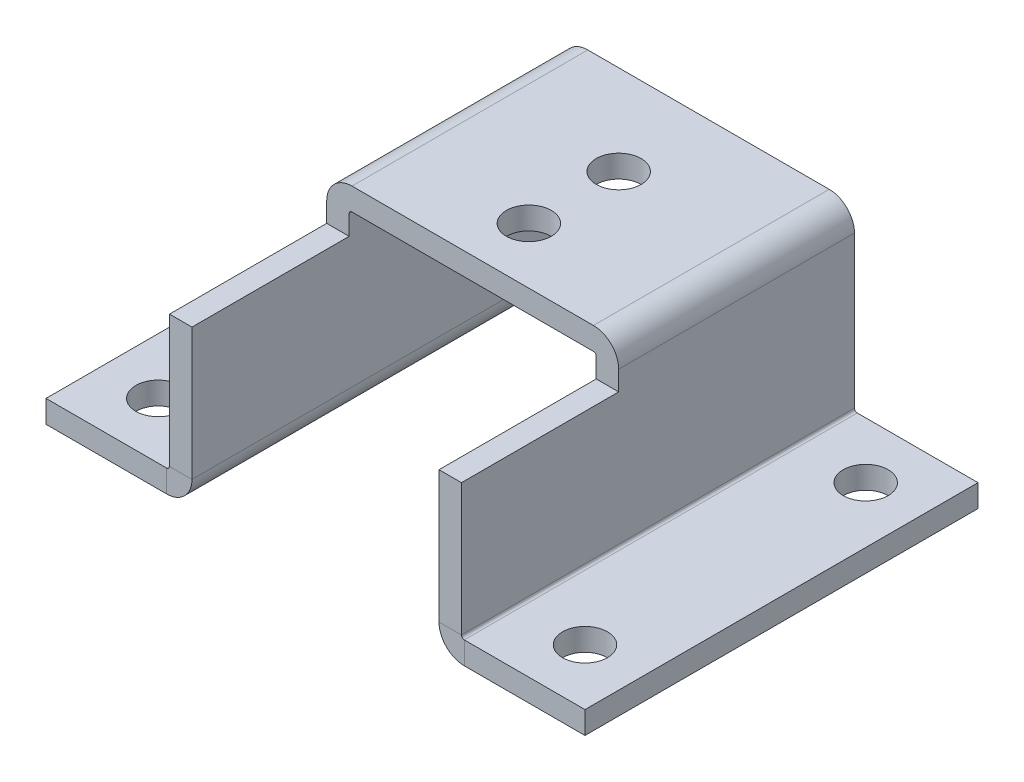
ISO-10303-21;
HEADER;
FILE_DESCRIPTION(('STEP AP214'),'2;1');
FILE_NAME('part.step','',(''),(''),'','','');
FILE_SCHEMA(('AUTOMOTIVE_DESIGN { 1 0 10303 214 1 1 1 1 }'));
ENDSEC;
DATA;
#1=APPLICATION_CONTEXT('core data for automotive mechanical design processes');
#2=APPLICATION_PROTOCOL_DEFINITION('international standard','automotive_design',2000,#1);
#3=PRODUCT_CONTEXT('',#1,'mechanical');
#4=PRODUCT('Part','Part','',(#3));
#5=PRODUCT_RELATED_PRODUCT_CATEGORY('part','',(#4));
#6=PRODUCT_DEFINITION_FORMATION('','',#4);
#7=PRODUCT_DEFINITION_CONTEXT('part definition',#1,'design');
#8=PRODUCT_DEFINITION('design','',#6,#7);
#9=PRODUCT_DEFINITION_SHAPE('','',#8);
#10=(LENGTH_UNIT() NAMED_UNIT(*) SI_UNIT(.MILLI.,.METRE.));
#11=(NAMED_UNIT(*) PLANE_ANGLE_UNIT() SI_UNIT($,.RADIAN.));
#12=(NAMED_UNIT(*) SI_UNIT($,.STERADIAN.) SOLID_ANGLE_UNIT());
#13=UNCERTAINTY_MEASURE_WITH_UNIT(LENGTH_MEASURE(1.E-05),#10,'distance_accuracy_value','');
#14=(GEOMETRIC_REPRESENTATION_CONTEXT(3) GLOBAL_UNCERTAINTY_ASSIGNED_CONTEXT((#13)) GLOBAL_UNIT_ASSIGNED_CONTEXT((#10,
#11,#12)) REPRESENTATION_CONTEXT('',''));
#15=CARTESIAN_POINT('',(0.,0.,0.));
#16=DIRECTION('',(0.,0.,1.));
#17=DIRECTION('',(1.,0.,0.));
#18=AXIS2_PLACEMENT_3D('',#15,#16,#17);
#19=CARTESIAN_POINT('',(-24.,-16.,0.));
#20=DIRECTION('',(-1.,0.,0.));
#21=DIRECTION('',(0.,0.,1.));
#22=AXIS2_PLACEMENT_3D('',#19,#20,#21);
#23=PLANE('',#22);
#24=DIRECTION('',(0.,1.,0.));
#25=VECTOR('',#24,1.);
#26=CARTESIAN_POINT('',(-24.,-15.,-17.5));
#27=LINE('',#26,#25);
#28=CARTESIAN_POINT('',(-24.,-17.,-17.5));
#29=VERTEX_POINT('',#28);
#30=CARTESIAN_POINT('',(-24.,-15.,-17.5));
#31=VERTEX_POINT('',#30);
#32=EDGE_CURVE('E265',#29,#31,#27,.T.);
#33=ORIENTED_EDGE('',*,*,#32,.F.);
#34=DIRECTION('',(0.,0.,-1.));
#35=VECTOR('',#34,1.);
#36=CARTESIAN_POINT('',(-24.,-17.,-17.5));
#37=LINE('',#36,#35);
#38=CARTESIAN_POINT('',(-24.,-17.,17.5));
#39=VERTEX_POINT('',#38);
#40=EDGE_CURVE('E262',#39,#29,#37,.T.);
#41=ORIENTED_EDGE('',*,*,#40,.F.);
#42=DIRECTION('',(0.,-1.,0.));
#43=VECTOR('',#42,1.);
#44=CARTESIAN_POINT('',(-24.,-17.,17.5));
#45=LINE('',#44,#43);
#46=CARTESIAN_POINT('',(-24.,-15.,17.5));
#47=VERTEX_POINT('',#46);
#48=EDGE_CURVE('E266',#47,#39,#45,.T.);
#49=ORIENTED_EDGE('',*,*,#48,.F.);
#50=DIRECTION('',(0.,0.,1.));
#51=VECTOR('',#50,1.);
#52=CARTESIAN_POINT('',(-24.,-15.,17.5));
#53=LINE('',#52,#51);
#54=EDGE_CURVE('E328',#31,#47,#53,.T.);
#55=ORIENTED_EDGE('',*,*,#54,.F.);
#56=EDGE_LOOP('',(#33,#41,#49,#55));
#57=FACE_BOUND('',#56,.T.);
#58=ADVANCED_FACE('F38',(#57),#23,.T.);
#59=CARTESIAN_POINT('',(24.,-16.,0.));
#60=DIRECTION('',(-1.,0.,0.));
#61=DIRECTION('',(0.,0.,1.));
#62=AXIS2_PLACEMENT_3D('',#59,#60,#61);
#63=PLANE('',#62);
#64=DIRECTION('',(0.,1.,0.));
#65=VECTOR('',#64,1.);
#66=CARTESIAN_POINT('',(24.,-15.,-17.5));
#67=LINE('',#66,#65);
#68=CARTESIAN_POINT('',(24.,-17.,-17.5));
#69=VERTEX_POINT('',#68);
#70=CARTESIAN_POINT('',(24.,-15.,-17.5));
#71=VERTEX_POINT('',#70);
#72=EDGE_CURVE('E62',#69,#71,#67,.T.);
#73=ORIENTED_EDGE('',*,*,#72,.T.);
#74=DIRECTION('',(0.,0.,1.));
#75=VECTOR('',#74,1.);
#76=CARTESIAN_POINT('',(24.,-15.,17.5));
#77=LINE('',#76,#75);
#78=CARTESIAN_POINT('',(24.,-15.,17.5));
#79=VERTEX_POINT('',#78);
#80=EDGE_CURVE('E371',#71,#79,#77,.T.);
#81=ORIENTED_EDGE('',*,*,#80,.T.);
#82=DIRECTION('',(0.,-1.,0.));
#83=VECTOR('',#82,1.);
#84=CARTESIAN_POINT('',(24.,-17.,17.5));
#85=LINE('',#84,#83);
#86=CARTESIAN_POINT('',(24.,-17.,17.5));
#87=VERTEX_POINT('',#86);
#88=EDGE_CURVE('E252',#79,#87,#85,.T.);
#89=ORIENTED_EDGE('',*,*,#88,.T.);
#90=DIRECTION('',(0.,0.,-1.));
#91=VECTOR('',#90,1.);
#92=CARTESIAN_POINT('',(24.,-17.,-17.5));
#93=LINE('',#92,#91);
#94=EDGE_CURVE('E258',#87,#69,#93,.T.);
#95=ORIENTED_EDGE('',*,*,#94,.T.);
#96=EDGE_LOOP('',(#73,#81,#89,#95));
#97=FACE_BOUND('',#96,.T.);
#98=ADVANCED_FACE('F558',(#97),#63,.F.);
#99=CARTESIAN_POINT('',(-24.,-17.,17.5));
#100=DIRECTION('',(0.,0.,1.));
#101=DIRECTION('',(1.,0.,0.));
#102=AXIS2_PLACEMENT_3D('',#99,#100,#101);
#103=PLANE('',#102);
#104=DIRECTION('',(1.,0.,0.));
#105=VECTOR('',#104,1.);
#106=CARTESIAN_POINT('',(-24.,-17.,17.5));
#107=LINE('',#106,#105);
#108=CARTESIAN_POINT('',(-13.25,-17.,17.5));
#109=VERTEX_POINT('',#108);
#110=EDGE_CURVE('E271',#39,#109,#107,.T.);
#111=ORIENTED_EDGE('',*,*,#110,.T.);
#112=DIRECTION('',(0.,-1.,0.));
#113=VECTOR('',#112,1.);
#114=CARTESIAN_POINT('',(-13.25,-17.,17.5));
#115=LINE('',#114,#113);
#116=CARTESIAN_POINT('',(-13.25,-15.,17.5));
#117=VERTEX_POINT('',#116);
#118=EDGE_CURVE('E443',#117,#109,#115,.T.);
#119=ORIENTED_EDGE('',*,*,#118,.F.);
#120=DIRECTION('',(1.,0.,0.));
#121=VECTOR('',#120,1.);
#122=CARTESIAN_POINT('',(-24.,-15.,17.5));
#123=LINE('',#122,#121);
#124=EDGE_CURVE('E374',#47,#117,#123,.T.);
#125=ORIENTED_EDGE('',*,*,#124,.F.);
#126=ORIENTED_EDGE('',*,*,#48,.T.);
#127=EDGE_LOOP('',(#111,#119,#125,#126));
#128=FACE_BOUND('',#127,.T.);
#129=ADVANCED_FACE('F469',(#128),#103,.T.);
#130=CARTESIAN_POINT('',(-24.,-17.,-17.5));
#131=DIRECTION('',(0.,-1.,0.));
#132=DIRECTION('',(1.,0.,0.));
#133=AXIS2_PLACEMENT_3D('',#130,#131,#132);
#134=PLANE('',#133);
#135=CARTESIAN_POINT('',(-19.,-17.,-12.5));
#136=DIRECTION('',(0.,1.,0.));
#137=DIRECTION('',(-1.,0.,0.));
#138=AXIS2_PLACEMENT_3D('',#135,#136,#137);
#139=CIRCLE('',#138,2.);
#140=CARTESIAN_POINT('',(-21.,-17.,-12.5));
#141=VERTEX_POINT('',#140);
#142=EDGE_CURVE('E396',#141,#141,#139,.T.);
#143=ORIENTED_EDGE('',*,*,#142,.T.);
#144=EDGE_LOOP('',(#143));
#145=FACE_BOUND('',#144,.T.);
#146=CARTESIAN_POINT('',(-19.,-17.,12.5));
#147=DIRECTION('',(0.,1.,0.));
#148=DIRECTION('',(-1.,0.,0.));
#149=AXIS2_PLACEMENT_3D('',#146,#147,#148);
#150=CIRCLE('',#149,2.);
#151=CARTESIAN_POINT('',(-21.,-17.,12.5));
#152=VERTEX_POINT('',#151);
#153=EDGE_CURVE('E686',#152,#152,#150,.T.);
#154=ORIENTED_EDGE('',*,*,#153,.T.);
#155=EDGE_LOOP('',(#154));
#156=FACE_BOUND('',#155,.T.);
#157=DIRECTION('',(1.,0.,0.));
#158=VECTOR('',#157,1.);
#159=CARTESIAN_POINT('',(-24.,-17.,-17.5));
#160=LINE('',#159,#158);
#161=CARTESIAN_POINT('',(-13.25,-17.,-17.5));
#162=VERTEX_POINT('',#161);
#163=EDGE_CURVE('E270',#29,#162,#160,.T.);
#164=ORIENTED_EDGE('',*,*,#163,.T.);
#165=DIRECTION('',(0.,0.,-1.));
#166=VECTOR('',#165,1.);
#167=CARTESIAN_POINT('',(-13.25,-17.,-17.5));
#168=LINE('',#167,#166);
#169=EDGE_CURVE('E267',#109,#162,#168,.T.);
#170=ORIENTED_EDGE('',*,*,#169,.F.);
#171=ORIENTED_EDGE('',*,*,#110,.F.);
#172=ORIENTED_EDGE('',*,*,#40,.T.);
#173=EDGE_LOOP('',(#164,#170,#171,#172));
#174=FACE_BOUND('',#173,.T.);
#175=ADVANCED_FACE('F466',(#145,#156,#174),#134,.T.);
#176=CARTESIAN_POINT('',(-24.,-15.,-17.5));
#177=DIRECTION('',(0.,0.,-1.));
#178=DIRECTION('',(-1.,0.,0.));
#179=AXIS2_PLACEMENT_3D('',#176,#177,#178);
#180=PLANE('',#179);
#181=DIRECTION('',(1.,0.,0.));
#182=VECTOR('',#181,1.);
#183=CARTESIAN_POINT('',(-24.,-15.,-17.5));
#184=LINE('',#183,#182);
#185=CARTESIAN_POINT('',(-13.25,-15.,-17.5));
#186=VERTEX_POINT('',#185);
#187=EDGE_CURVE('E331',#31,#186,#184,.T.);
#188=ORIENTED_EDGE('',*,*,#187,.T.);
#189=DIRECTION('',(0.,1.,0.));
#190=VECTOR('',#189,1.);
#191=CARTESIAN_POINT('',(-13.25,-15.,-17.5));
#192=LINE('',#191,#190);
#193=EDGE_CURVE('E274',#162,#186,#192,.T.);
#194=ORIENTED_EDGE('',*,*,#193,.F.);
#195=ORIENTED_EDGE('',*,*,#163,.F.);
#196=ORIENTED_EDGE('',*,*,#32,.T.);
#197=EDGE_LOOP('',(#188,#194,#195,#196));
#198=FACE_BOUND('',#197,.T.);
#199=ADVANCED_FACE('F477',(#198),#180,.T.);
#200=CARTESIAN_POINT('',(-24.,-15.,17.5));
#201=DIRECTION('',(0.,1.,0.));
#202=DIRECTION('',(-1.,0.,0.));
#203=AXIS2_PLACEMENT_3D('',#200,#201,#202);
#204=PLANE('',#203);
#205=CARTESIAN_POINT('',(-19.,-15.,-12.5));
#206=DIRECTION('',(0.,1.,0.));
#207=DIRECTION('',(-1.,0.,0.));
#208=AXIS2_PLACEMENT_3D('',#205,#206,#207);
#209=CIRCLE('',#208,2.);
#210=CARTESIAN_POINT('',(-21.,-15.,-12.5));
#211=VERTEX_POINT('',#210);
#212=EDGE_CURVE('E41',#211,#211,#209,.T.);
#213=ORIENTED_EDGE('',*,*,#212,.F.);
#214=EDGE_LOOP('',(#213));
#215=FACE_BOUND('',#214,.T.);
#216=CARTESIAN_POINT('',(-19.,-15.,12.5));
#217=DIRECTION('',(0.,1.,0.));
#218=DIRECTION('',(-1.,0.,0.));
#219=AXIS2_PLACEMENT_3D('',#216,#217,#218);
#220=CIRCLE('',#219,2.);
#221=CARTESIAN_POINT('',(-21.,-15.,12.5));
#222=VERTEX_POINT('',#221);
#223=EDGE_CURVE('E406',#222,#222,#220,.T.);
#224=ORIENTED_EDGE('',*,*,#223,.F.);
#225=EDGE_LOOP('',(#224));
#226=FACE_BOUND('',#225,.T.);
#227=DIRECTION('',(0.,0.,1.));
#228=VECTOR('',#227,1.);
#229=CARTESIAN_POINT('',(-13.25,-15.,17.5));
#230=LINE('',#229,#228);
#231=EDGE_CURVE('E334',#186,#117,#230,.T.);
#232=ORIENTED_EDGE('',*,*,#231,.F.);
#233=ORIENTED_EDGE('',*,*,#187,.F.);
#234=ORIENTED_EDGE('',*,*,#54,.T.);
#235=ORIENTED_EDGE('',*,*,#124,.T.);
#236=EDGE_LOOP('',(#232,#233,#234,#235));
#237=FACE_BOUND('',#236,.T.);
#238=ADVANCED_FACE('F474',(#215,#226,#237),#204,.T.);
#239=CARTESIAN_POINT('',(-13.25,-17.,17.5));
#240=DIRECTION('',(0.,0.,1.));
#241=DIRECTION('',(1.,0.,0.));
#242=AXIS2_PLACEMENT_3D('',#239,#240,#241);
#243=PLANE('',#242);
#244=CARTESIAN_POINT('',(-13.25,-14.75,17.5));
#245=DIRECTION('',(0.,0.,1.));
#246=DIRECTION('',(0.,-1.,0.));
#247=AXIS2_PLACEMENT_3D('',#244,#245,#246);
#248=CIRCLE('',#247,2.25);
#249=CARTESIAN_POINT('',(-11.,-14.75,17.5));
#250=VERTEX_POINT('',#249);
#251=EDGE_CURVE('E279',#109,#250,#248,.T.);
#252=ORIENTED_EDGE('',*,*,#251,.T.);
#253=DIRECTION('',(1.,0.,0.));
#254=VECTOR('',#253,1.);
#255=CARTESIAN_POINT('',(-11.,-14.75,17.5));
#256=LINE('',#255,#254);
#257=CARTESIAN_POINT('',(-13.,-14.75,17.5));
#258=VERTEX_POINT('',#257);
#259=EDGE_CURVE('E450',#258,#250,#256,.T.);
#260=ORIENTED_EDGE('',*,*,#259,.F.);
#261=CARTESIAN_POINT('',(-13.25,-14.75,17.5));
#262=DIRECTION('',(0.,0.,1.));
#263=DIRECTION('',(0.,-1.,0.));
#264=AXIS2_PLACEMENT_3D('',#261,#262,#263);
#265=CIRCLE('',#264,0.249999999999999);
#266=EDGE_CURVE('E376',#117,#258,#265,.T.);
#267=ORIENTED_EDGE('',*,*,#266,.F.);
#268=ORIENTED_EDGE('',*,*,#118,.T.);
#269=EDGE_LOOP('',(#252,#260,#267,#268));
#270=FACE_BOUND('',#269,.T.);
#271=ADVANCED_FACE('F459',(#270),#243,.T.);
#272=CARTESIAN_POINT('',(-13.25,-14.75,0.));
#273=DIRECTION('',(0.,0.,1.));
#274=DIRECTION('',(1.,0.,0.));
#275=AXIS2_PLACEMENT_3D('',#272,#273,#274);
#276=CYLINDRICAL_SURFACE('',#275,2.25);
#277=CARTESIAN_POINT('',(-13.25,-14.75,-17.5));
#278=DIRECTION('',(0.,0.,1.));
#279=DIRECTION('',(0.,-1.,0.));
#280=AXIS2_PLACEMENT_3D('',#277,#278,#279);
#281=CIRCLE('',#280,2.24999999999999);
#282=CARTESIAN_POINT('',(-11.,-14.75,-17.5));
#283=VERTEX_POINT('',#282);
#284=EDGE_CURVE('E278',#162,#283,#281,.T.);
#285=ORIENTED_EDGE('',*,*,#284,.T.);
#286=DIRECTION('',(0.,0.,-1.));
#287=VECTOR('',#286,1.);
#288=CARTESIAN_POINT('',(-11.,-14.75,-17.5));
#289=LINE('',#288,#287);
#290=EDGE_CURVE('E275',#250,#283,#289,.T.);
#291=ORIENTED_EDGE('',*,*,#290,.F.);
#292=ORIENTED_EDGE('',*,*,#251,.F.);
#293=ORIENTED_EDGE('',*,*,#169,.T.);
#294=EDGE_LOOP('',(#285,#291,#292,#293));
#295=FACE_BOUND('',#294,.T.);
#296=ADVANCED_FACE('F463',(#295),#276,.T.);
#297=CARTESIAN_POINT('',(-13.25,-15.,-17.5));
#298=DIRECTION('',(0.,0.,-1.));
#299=DIRECTION('',(-1.,0.,0.));
#300=AXIS2_PLACEMENT_3D('',#297,#298,#299);
#301=PLANE('',#300);
#302=CARTESIAN_POINT('',(-13.25,-14.75,-17.5));
#303=DIRECTION('',(0.,0.,1.));
#304=DIRECTION('',(0.,-1.,0.));
#305=AXIS2_PLACEMENT_3D('',#302,#303,#304);
#306=CIRCLE('',#305,0.249999999999993);
#307=CARTESIAN_POINT('',(-13.,-14.75,-17.5));
#308=VERTEX_POINT('',#307);
#309=EDGE_CURVE('E228',#186,#308,#306,.T.);
#310=ORIENTED_EDGE('',*,*,#309,.T.);
#311=DIRECTION('',(-1.,0.,0.));
#312=VECTOR('',#311,1.);
#313=CARTESIAN_POINT('',(-13.,-14.75,-17.5));
#314=LINE('',#313,#312);
#315=EDGE_CURVE('E282',#283,#308,#314,.T.);
#316=ORIENTED_EDGE('',*,*,#315,.F.);
#317=ORIENTED_EDGE('',*,*,#284,.F.);
#318=ORIENTED_EDGE('',*,*,#193,.T.);
#319=EDGE_LOOP('',(#310,#316,#317,#318));
#320=FACE_BOUND('',#319,.T.);
#321=ADVANCED_FACE('F479',(#320),#301,.T.);
#322=CARTESIAN_POINT('',(-13.25,-14.75,0.));
#323=DIRECTION('',(0.,0.,1.));
#324=DIRECTION('',(1.,0.,0.));
#325=AXIS2_PLACEMENT_3D('',#322,#323,#324);
#326=CYLINDRICAL_SURFACE('',#325,0.249999999999995);
#327=DIRECTION('',(0.,0.,1.));
#328=VECTOR('',#327,1.);
#329=CARTESIAN_POINT('',(-13.,-14.75,17.5));
#330=LINE('',#329,#328);
#331=EDGE_CURVE('E223',#308,#258,#330,.T.);
#332=ORIENTED_EDGE('',*,*,#331,.F.);
#333=ORIENTED_EDGE('',*,*,#309,.F.);
#334=ORIENTED_EDGE('',*,*,#231,.T.);
#335=ORIENTED_EDGE('',*,*,#266,.T.);
#336=EDGE_LOOP('',(#332,#333,#334,#335));
#337=FACE_BOUND('',#336,.T.);
#338=ADVANCED_FACE('F455',(#337),#326,.F.);
#339=CARTESIAN_POINT('',(-11.,-14.75,17.5));
#340=DIRECTION('',(0.,0.,1.));
#341=DIRECTION('',(1.,0.,0.));
#342=AXIS2_PLACEMENT_3D('',#339,#340,#341);
#343=PLANE('',#342);
#344=DIRECTION('',(1.,0.,0.));
#345=VECTOR('',#344,1.);
#346=CARTESIAN_POINT('',(-24.,-3.,17.5));
#347=LINE('',#346,#345);
#348=CARTESIAN_POINT('',(-13.,-3.,17.5));
#349=VERTEX_POINT('',#348);
#350=CARTESIAN_POINT('',(-11.,-3.,17.5));
#351=VERTEX_POINT('',#350);
#352=EDGE_CURVE('E202',#349,#351,#347,.T.);
#353=ORIENTED_EDGE('',*,*,#352,.F.);
#354=DIRECTION('',(0.,1.,0.));
#355=VECTOR('',#354,1.);
#356=CARTESIAN_POINT('',(-13.,-14.75,17.5));
#357=LINE('',#356,#355);
#358=EDGE_CURVE('E216',#258,#349,#357,.T.);
#359=ORIENTED_EDGE('',*,*,#358,.F.);
#360=ORIENTED_EDGE('',*,*,#259,.T.);
#361=DIRECTION('',(0.,1.,0.));
#362=VECTOR('',#361,1.);
#363=CARTESIAN_POINT('',(-11.,-14.75,17.5));
#364=LINE('',#363,#362);
#365=EDGE_CURVE('E218',#250,#351,#364,.T.);
#366=ORIENTED_EDGE('',*,*,#365,.T.);
#367=EDGE_LOOP('',(#353,#359,#360,#366));
#368=FACE_BOUND('',#367,.T.);
#369=ADVANCED_FACE('F214',(#368),#343,.T.);
#370=CARTESIAN_POINT('',(-11.,-14.75,-17.5));
#371=DIRECTION('',(1.,0.,0.));
#372=DIRECTION('',(0.,0.,-1.));
#373=AXIS2_PLACEMENT_3D('',#370,#371,#372);
#374=PLANE('',#373);
#375=DIRECTION('',(0.,1.,0.));
#376=VECTOR('',#375,1.);
#377=CARTESIAN_POINT('',(-11.,-14.75,3.5));
#378=LINE('',#377,#376);
#379=CARTESIAN_POINT('',(-11.,-3.,3.5));
#380=VERTEX_POINT('',#379);
#381=CARTESIAN_POINT('',(-11.,-1.25,3.5));
#382=VERTEX_POINT('',#381);
#383=EDGE_CURVE('E435',#380,#382,#378,.T.);
#384=ORIENTED_EDGE('',*,*,#383,.F.);
#385=DIRECTION('',(0.,0.,-1.));
#386=VECTOR('',#385,1.);
#387=CARTESIAN_POINT('',(-11.,-3.,-17.5));
#388=LINE('',#387,#386);
#389=EDGE_CURVE('E209',#351,#380,#388,.T.);
#390=ORIENTED_EDGE('',*,*,#389,.F.);
#391=ORIENTED_EDGE('',*,*,#365,.F.);
#392=ORIENTED_EDGE('',*,*,#290,.T.);
#393=DIRECTION('',(0.,1.,0.));
#394=VECTOR('',#393,1.);
#395=CARTESIAN_POINT('',(-11.,-14.75,-17.5));
#396=LINE('',#395,#394);
#397=CARTESIAN_POINT('',(-11.,-1.25000000000001,-17.5));
#398=VERTEX_POINT('',#397);
#399=EDGE_CURVE('E284',#283,#398,#396,.T.);
#400=ORIENTED_EDGE('',*,*,#399,.T.);
#401=DIRECTION('',(0.,0.,-1.));
#402=VECTOR('',#401,1.);
#403=CARTESIAN_POINT('',(-11.,-1.25000000000001,-17.5));
#404=LINE('',#403,#402);
#405=EDGE_CURVE('E226',#382,#398,#404,.T.);
#406=ORIENTED_EDGE('',*,*,#405,.F.);
#407=EDGE_LOOP('',(#384,#390,#391,#392,#400,#406));
#408=FACE_BOUND('',#407,.T.);
#409=ADVANCED_FACE('F483',(#408),#374,.T.);
#410=CARTESIAN_POINT('',(-13.,-14.75,-17.5));
#411=DIRECTION('',(0.,0.,-1.));
#412=DIRECTION('',(-1.,0.,0.));
#413=AXIS2_PLACEMENT_3D('',#410,#411,#412);
#414=PLANE('',#413);
#415=DIRECTION('',(0.,1.,0.));
#416=VECTOR('',#415,1.);
#417=CARTESIAN_POINT('',(-13.,-14.75,-17.5));
#418=LINE('',#417,#416);
#419=CARTESIAN_POINT('',(-13.,-1.25000000000001,-17.5));
#420=VERTEX_POINT('',#419);
#421=EDGE_CURVE('E341',#308,#420,#418,.T.);
#422=ORIENTED_EDGE('',*,*,#421,.T.);
#423=DIRECTION('',(-1.,0.,0.));
#424=VECTOR('',#423,1.);
#425=CARTESIAN_POINT('',(-13.,-1.25000000000001,-17.5));
#426=LINE('',#425,#424);
#427=EDGE_CURVE('E287',#398,#420,#426,.T.);
#428=ORIENTED_EDGE('',*,*,#427,.F.);
#429=ORIENTED_EDGE('',*,*,#399,.F.);
#430=ORIENTED_EDGE('',*,*,#315,.T.);
#431=EDGE_LOOP('',(#422,#428,#429,#430));
#432=FACE_BOUND('',#431,.T.);
#433=ADVANCED_FACE('F597',(#432),#414,.T.);
#434=CARTESIAN_POINT('',(-13.,-14.75,17.5));
#435=DIRECTION('',(-1.,0.,0.));
#436=DIRECTION('',(0.,0.,1.));
#437=AXIS2_PLACEMENT_3D('',#434,#435,#436);
#438=PLANE('',#437);
#439=DIRECTION('',(0.,-1.,0.));
#440=VECTOR('',#439,1.);
#441=CARTESIAN_POINT('',(-13.,-14.75,3.5));
#442=LINE('',#441,#440);
#443=CARTESIAN_POINT('',(-13.,-1.25,3.5));
#444=VERTEX_POINT('',#443);
#445=CARTESIAN_POINT('',(-13.,-3.,3.5));
#446=VERTEX_POINT('',#445);
#447=EDGE_CURVE('E439',#444,#446,#442,.T.);
#448=ORIENTED_EDGE('',*,*,#447,.F.);
#449=DIRECTION('',(0.,0.,1.));
#450=VECTOR('',#449,1.);
#451=CARTESIAN_POINT('',(-13.,-1.25000000000001,17.5));
#452=LINE('',#451,#450);
#453=EDGE_CURVE('E291',#420,#444,#452,.T.);
#454=ORIENTED_EDGE('',*,*,#453,.F.);
#455=ORIENTED_EDGE('',*,*,#421,.F.);
#456=ORIENTED_EDGE('',*,*,#331,.T.);
#457=ORIENTED_EDGE('',*,*,#358,.T.);
#458=DIRECTION('',(0.,0.,1.));
#459=VECTOR('',#458,1.);
#460=CARTESIAN_POINT('',(-13.,-3.,17.5));
#461=LINE('',#460,#459);
#462=EDGE_CURVE('E199',#446,#349,#461,.T.);
#463=ORIENTED_EDGE('',*,*,#462,.F.);
#464=EDGE_LOOP('',(#448,#454,#455,#456,#457,#463));
#465=FACE_BOUND('',#464,.T.);
#466=ADVANCED_FACE('F221',(#465),#438,.T.);
#467=CARTESIAN_POINT('',(-10.75,-1.25,0.));
#468=DIRECTION('',(0.,0.,-1.));
#469=DIRECTION('',(-1.,0.,0.));
#470=AXIS2_PLACEMENT_3D('',#467,#468,#469);
#471=CYLINDRICAL_SURFACE('',#470,0.250000000000002);
#472=CARTESIAN_POINT('',(-10.75,-1.25,3.5));
#473=DIRECTION('',(0.,0.,-1.));
#474=DIRECTION('',(-1.,0.,0.));
#475=AXIS2_PLACEMENT_3D('',#472,#473,#474);
#476=CIRCLE('',#475,0.250000000000002);
#477=CARTESIAN_POINT('',(-10.75,-1.,3.5));
#478=VERTEX_POINT('',#477);
#479=EDGE_CURVE('E433',#382,#478,#476,.T.);
#480=ORIENTED_EDGE('',*,*,#479,.F.);
#481=ORIENTED_EDGE('',*,*,#405,.T.);
#482=CARTESIAN_POINT('',(-10.75,-1.25,-17.5));
#483=DIRECTION('',(0.,0.,-1.));
#484=DIRECTION('',(-1.,0.,0.));
#485=AXIS2_PLACEMENT_3D('',#482,#483,#484);
#486=CIRCLE('',#485,0.250000000000007);
#487=CARTESIAN_POINT('',(-10.75,-0.999999999999995,-17.5));
#488=VERTEX_POINT('',#487);
#489=EDGE_CURVE('E290',#398,#488,#486,.T.);
#490=ORIENTED_EDGE('',*,*,#489,.T.);
#491=DIRECTION('',(0.,0.,-1.));
#492=VECTOR('',#491,1.);
#493=CARTESIAN_POINT('',(-10.75,-0.999999999999995,-17.5));
#494=LINE('',#493,#492);
#495=EDGE_CURVE('E288',#478,#488,#494,.T.);
#496=ORIENTED_EDGE('',*,*,#495,.F.);
#497=EDGE_LOOP('',(#480,#481,#490,#496));
#498=FACE_BOUND('',#497,.T.);
#499=ADVANCED_FACE('F596',(#498),#471,.F.);
#500=CARTESIAN_POINT('',(-13.,-1.25000000000002,-17.5));
#501=DIRECTION('',(0.,0.,-1.));
#502=DIRECTION('',(-1.,0.,0.));
#503=AXIS2_PLACEMENT_3D('',#500,#501,#502);
#504=PLANE('',#503);
#505=CARTESIAN_POINT('',(-10.75,-1.25,-17.5));
#506=DIRECTION('',(0.,0.,-1.));
#507=DIRECTION('',(-1.,0.,0.));
#508=AXIS2_PLACEMENT_3D('',#505,#506,#507);
#509=CIRCLE('',#508,2.25000000000001);
#510=CARTESIAN_POINT('',(-10.75,1.,-17.5));
#511=VERTEX_POINT('',#510);
#512=EDGE_CURVE('E346',#420,#511,#509,.T.);
#513=ORIENTED_EDGE('',*,*,#512,.T.);
#514=DIRECTION('',(0.,1.,0.));
#515=VECTOR('',#514,1.);
#516=CARTESIAN_POINT('',(-10.75,1.,-17.5));
#517=LINE('',#516,#515);
#518=EDGE_CURVE('E294',#488,#511,#517,.T.);
#519=ORIENTED_EDGE('',*,*,#518,.F.);
#520=ORIENTED_EDGE('',*,*,#489,.F.);
#521=ORIENTED_EDGE('',*,*,#427,.T.);
#522=EDGE_LOOP('',(#513,#519,#520,#521));
#523=FACE_BOUND('',#522,.T.);
#524=ADVANCED_FACE('F495',(#523),#504,.T.);
#525=CARTESIAN_POINT('',(-10.75,-1.25,0.));
#526=DIRECTION('',(0.,0.,-1.));
#527=DIRECTION('',(-1.,0.,0.));
#528=AXIS2_PLACEMENT_3D('',#525,#526,#527);
#529=CYLINDRICAL_SURFACE('',#528,2.25);
#530=CARTESIAN_POINT('',(-10.75,-1.25,3.5));
#531=DIRECTION('',(0.,0.,-1.));
#532=DIRECTION('',(-1.,0.,0.));
#533=AXIS2_PLACEMENT_3D('',#530,#531,#532);
#534=CIRCLE('',#533,2.25);
#535=CARTESIAN_POINT('',(-10.75,1.00000000000001,3.5));
#536=VERTEX_POINT('',#535);
#537=EDGE_CURVE('E437',#536,#444,#534,.F.);
#538=ORIENTED_EDGE('',*,*,#537,.F.);
#539=DIRECTION('',(0.,0.,1.));
#540=VECTOR('',#539,1.);
#541=CARTESIAN_POINT('',(-10.75,0.999999999999997,17.5));
#542=LINE('',#541,#540);
#543=EDGE_CURVE('E302',#511,#536,#542,.T.);
#544=ORIENTED_EDGE('',*,*,#543,.F.);
#545=ORIENTED_EDGE('',*,*,#512,.F.);
#546=ORIENTED_EDGE('',*,*,#453,.T.);
#547=EDGE_LOOP('',(#538,#544,#545,#546));
#548=FACE_BOUND('',#547,.T.);
#549=ADVANCED_FACE('F491',(#548),#529,.T.);
#550=CARTESIAN_POINT('',(-10.75,-0.999999999999995,-17.5));
#551=DIRECTION('',(0.,-1.,0.));
#552=DIRECTION('',(1.,0.,0.));
#553=AXIS2_PLACEMENT_3D('',#550,#551,#552);
#554=PLANE('',#553);
#555=CARTESIAN_POINT('',(0.,-0.999999999999994,-9.5));
#556=DIRECTION('',(0.,-1.,0.));
#557=DIRECTION('',(1.,0.,0.));
#558=AXIS2_PLACEMENT_3D('',#555,#556,#557);
#559=CIRCLE('',#558,2.);
#560=CARTESIAN_POINT('',(2.,-0.999999999999993,-9.5));
#561=VERTEX_POINT('',#560);
#562=EDGE_CURVE('E405',#561,#561,#559,.T.);
#563=ORIENTED_EDGE('',*,*,#562,.F.);
#564=EDGE_LOOP('',(#563));
#565=FACE_BOUND('',#564,.T.);
#566=CARTESIAN_POINT('',(0.,-0.999999999999994,-1.5));
#567=DIRECTION('',(0.,-1.,0.));
#568=DIRECTION('',(1.,0.,0.));
#569=AXIS2_PLACEMENT_3D('',#566,#567,#568);
#570=CIRCLE('',#569,2.);
#571=CARTESIAN_POINT('',(2.,-0.999999999999993,-1.5));
#572=VERTEX_POINT('',#571);
#573=EDGE_CURVE('E402',#572,#572,#570,.T.);
#574=ORIENTED_EDGE('',*,*,#573,.F.);
#575=EDGE_LOOP('',(#574));
#576=FACE_BOUND('',#575,.T.);
#577=DIRECTION('',(1.,0.,0.));
#578=VECTOR('',#577,1.);
#579=CARTESIAN_POINT('',(-10.75,-1.,3.5));
#580=LINE('',#579,#578);
#581=CARTESIAN_POINT('',(10.75,-0.999999999999994,3.5));
#582=VERTEX_POINT('',#581);
#583=EDGE_CURVE('E431',#478,#582,#580,.T.);
#584=ORIENTED_EDGE('',*,*,#583,.F.);
#585=ORIENTED_EDGE('',*,*,#495,.T.);
#586=DIRECTION('',(1.,0.,0.));
#587=VECTOR('',#586,1.);
#588=CARTESIAN_POINT('',(-10.75,-0.999999999999995,-17.5));
#589=LINE('',#588,#587);
#590=CARTESIAN_POINT('',(10.75,-0.999999999999988,-17.5));
#591=VERTEX_POINT('',#590);
#592=EDGE_CURVE('E299',#488,#591,#589,.T.);
#593=ORIENTED_EDGE('',*,*,#592,.T.);
#594=DIRECTION('',(0.,0.,-1.));
#595=VECTOR('',#594,1.);
#596=CARTESIAN_POINT('',(10.75,-0.999999999999988,-17.5));
#597=LINE('',#596,#595);
#598=EDGE_CURVE('E295',#582,#591,#597,.T.);
#599=ORIENTED_EDGE('',*,*,#598,.F.);
#600=EDGE_LOOP('',(#584,#585,#593,#599));
#601=FACE_BOUND('',#600,.T.);
#602=ADVANCED_FACE('F507',(#565,#576,#601),#554,.T.);
#603=CARTESIAN_POINT('',(-10.75,1.,-17.5));
#604=DIRECTION('',(0.,0.,-1.));
#605=DIRECTION('',(-1.,0.,0.));
#606=AXIS2_PLACEMENT_3D('',#603,#604,#605);
#607=PLANE('',#606);
#608=DIRECTION('',(1.,0.,0.));
#609=VECTOR('',#608,1.);
#610=CARTESIAN_POINT('',(-10.75,1.,-17.5));
#611=LINE('',#610,#609);
#612=CARTESIAN_POINT('',(10.75,1.00000000000001,-17.5));
#613=VERTEX_POINT('',#612);
#614=EDGE_CURVE('E298',#511,#613,#611,.T.);
#615=ORIENTED_EDGE('',*,*,#614,.T.);
#616=DIRECTION('',(0.,1.,0.));
#617=VECTOR('',#616,1.);
#618=CARTESIAN_POINT('',(10.75,1.00000000000001,-17.5));
#619=LINE('',#618,#617);
#620=EDGE_CURVE('E297',#591,#613,#619,.T.);
#621=ORIENTED_EDGE('',*,*,#620,.F.);
#622=ORIENTED_EDGE('',*,*,#592,.F.);
#623=ORIENTED_EDGE('',*,*,#518,.T.);
#624=EDGE_LOOP('',(#615,#621,#622,#623));
#625=FACE_BOUND('',#624,.T.);
#626=ADVANCED_FACE('F500',(#625),#607,.T.);
#627=CARTESIAN_POINT('',(-10.75,0.999999999999997,17.5));
#628=DIRECTION('',(0.,1.,0.));
#629=DIRECTION('',(-1.,0.,0.));
#630=AXIS2_PLACEMENT_3D('',#627,#628,#629);
#631=PLANE('',#630);
#632=CARTESIAN_POINT('',(0.,1.,-9.5));
#633=DIRECTION('',(0.,1.,0.));
#634=DIRECTION('',(-1.,0.,0.));
#635=AXIS2_PLACEMENT_3D('',#632,#633,#634);
#636=CIRCLE('',#635,2.);
#637=CARTESIAN_POINT('',(-2.,1.,-9.5));
#638=VERTEX_POINT('',#637);
#639=EDGE_CURVE('E403',#638,#638,#636,.T.);
#640=ORIENTED_EDGE('',*,*,#639,.F.);
#641=EDGE_LOOP('',(#640));
#642=FACE_BOUND('',#641,.T.);
#643=CARTESIAN_POINT('',(0.,1.,-1.5));
#644=DIRECTION('',(0.,1.,0.));
#645=DIRECTION('',(-1.,0.,0.));
#646=AXIS2_PLACEMENT_3D('',#643,#644,#645);
#647=CIRCLE('',#646,2.);
#648=CARTESIAN_POINT('',(-2.,1.,-1.5));
#649=VERTEX_POINT('',#648);
#650=EDGE_CURVE('E399',#649,#649,#647,.T.);
#651=ORIENTED_EDGE('',*,*,#650,.F.);
#652=EDGE_LOOP('',(#651));
#653=FACE_BOUND('',#652,.T.);
#654=DIRECTION('',(1.,0.,0.));
#655=VECTOR('',#654,1.);
#656=CARTESIAN_POINT('',(-24.,1.00000000000001,3.5));
#657=LINE('',#656,#655);
#658=CARTESIAN_POINT('',(10.75,1.00000000000001,3.5));
#659=VERTEX_POINT('',#658);
#660=EDGE_CURVE('E418',#536,#659,#657,.T.);
#661=ORIENTED_EDGE('',*,*,#660,.T.);
#662=DIRECTION('',(0.,0.,1.));
#663=VECTOR('',#662,1.);
#664=CARTESIAN_POINT('',(10.75,1.,17.5));
#665=LINE('',#664,#663);
#666=EDGE_CURVE('E306',#613,#659,#665,.T.);
#667=ORIENTED_EDGE('',*,*,#666,.F.);
#668=ORIENTED_EDGE('',*,*,#614,.F.);
#669=ORIENTED_EDGE('',*,*,#543,.T.);
#670=EDGE_LOOP('',(#661,#667,#668,#669));
#671=FACE_BOUND('',#670,.T.);
#672=ADVANCED_FACE('F588',(#642,#653,#671),#631,.T.);
#673=CARTESIAN_POINT('',(10.75,-1.25,0.));
#674=DIRECTION('',(0.,0.,-1.));
#675=DIRECTION('',(-1.,0.,0.));
#676=AXIS2_PLACEMENT_3D('',#673,#674,#675);
#677=CYLINDRICAL_SURFACE('',#676,0.250000000000002);
#678=CARTESIAN_POINT('',(10.75,-1.25,3.5));
#679=DIRECTION('',(0.,0.,-1.));
#680=DIRECTION('',(-1.,0.,0.));
#681=AXIS2_PLACEMENT_3D('',#678,#679,#680);
#682=CIRCLE('',#681,0.250000000000002);
#683=CARTESIAN_POINT('',(11.,-1.25,3.5));
#684=VERTEX_POINT('',#683);
#685=EDGE_CURVE('E429',#582,#684,#682,.T.);
#686=ORIENTED_EDGE('',*,*,#685,.F.);
#687=ORIENTED_EDGE('',*,*,#598,.T.);
#688=CARTESIAN_POINT('',(10.75,-1.25,-17.5));
#689=DIRECTION('',(0.,0.,-1.));
#690=DIRECTION('',(0.,1.,0.));
#691=AXIS2_PLACEMENT_3D('',#688,#689,#690);
#692=CIRCLE('',#691,0.250000000000007);
#693=CARTESIAN_POINT('',(11.,-1.25,-17.5));
#694=VERTEX_POINT('',#693);
#695=EDGE_CURVE('E305',#591,#694,#692,.T.);
#696=ORIENTED_EDGE('',*,*,#695,.T.);
#697=DIRECTION('',(0.,0.,-1.));
#698=VECTOR('',#697,1.);
#699=CARTESIAN_POINT('',(11.,-1.25,-17.5));
#700=LINE('',#699,#698);
#701=EDGE_CURVE('E303',#684,#694,#700,.T.);
#702=ORIENTED_EDGE('',*,*,#701,.F.);
#703=EDGE_LOOP('',(#686,#687,#696,#702));
#704=FACE_BOUND('',#703,.T.);
#705=ADVANCED_FACE('F515',(#704),#677,.F.);
#706=CARTESIAN_POINT('',(10.75,1.00000000000001,-17.5));
#707=DIRECTION('',(0.,0.,-1.));
#708=DIRECTION('',(-1.,0.,0.));
#709=AXIS2_PLACEMENT_3D('',#706,#707,#708);
#710=PLANE('',#709);
#711=CARTESIAN_POINT('',(10.75,-1.25,-17.5));
#712=DIRECTION('',(0.,0.,-1.));
#713=DIRECTION('',(0.,1.,0.));
#714=AXIS2_PLACEMENT_3D('',#711,#712,#713);
#715=CIRCLE('',#714,2.25000000000001);
#716=CARTESIAN_POINT('',(13.,-1.25,-17.5));
#717=VERTEX_POINT('',#716);
#718=EDGE_CURVE('E354',#613,#717,#715,.T.);
#719=ORIENTED_EDGE('',*,*,#718,.T.);
#720=DIRECTION('',(1.,0.,0.));
#721=VECTOR('',#720,1.);
#722=CARTESIAN_POINT('',(13.,-1.25,-17.5));
#723=LINE('',#722,#721);
#724=EDGE_CURVE('E309',#694,#717,#723,.T.);
#725=ORIENTED_EDGE('',*,*,#724,.F.);
#726=ORIENTED_EDGE('',*,*,#695,.F.);
#727=ORIENTED_EDGE('',*,*,#620,.T.);
#728=EDGE_LOOP('',(#719,#725,#726,#727));
#729=FACE_BOUND('',#728,.T.);
#730=ADVANCED_FACE('F511',(#729),#710,.T.);
#731=CARTESIAN_POINT('',(10.75,-1.25,0.));
#732=DIRECTION('',(0.,0.,-1.));
#733=DIRECTION('',(-1.,0.,0.));
#734=AXIS2_PLACEMENT_3D('',#731,#732,#733);
#735=CYLINDRICAL_SURFACE('',#734,2.25);
#736=CARTESIAN_POINT('',(10.75,-1.25,3.5));
#737=DIRECTION('',(0.,0.,-1.));
#738=DIRECTION('',(-1.,0.,0.));
#739=AXIS2_PLACEMENT_3D('',#736,#737,#738);
#740=CIRCLE('',#739,2.25);
#741=CARTESIAN_POINT('',(13.,-1.25,3.5));
#742=VERTEX_POINT('',#741);
#743=EDGE_CURVE('E425',#742,#659,#740,.F.);
#744=ORIENTED_EDGE('',*,*,#743,.F.);
#745=DIRECTION('',(0.,0.,1.));
#746=VECTOR('',#745,1.);
#747=CARTESIAN_POINT('',(13.,-1.25,17.5));
#748=LINE('',#747,#746);
#749=EDGE_CURVE('E240',#717,#742,#748,.T.);
#750=ORIENTED_EDGE('',*,*,#749,.F.);
#751=ORIENTED_EDGE('',*,*,#718,.F.);
#752=ORIENTED_EDGE('',*,*,#666,.T.);
#753=EDGE_LOOP('',(#744,#750,#751,#752));
#754=FACE_BOUND('',#753,.T.);
#755=ADVANCED_FACE('F584',(#754),#735,.T.);
#756=CARTESIAN_POINT('',(11.,-1.25000000000001,17.5));
#757=DIRECTION('',(0.,0.,1.));
#758=DIRECTION('',(1.,0.,0.));
#759=AXIS2_PLACEMENT_3D('',#756,#757,#758);
#760=PLANE('',#759);
#761=CARTESIAN_POINT('',(11.,-3.,17.5));
#762=VERTEX_POINT('',#761);
#763=CARTESIAN_POINT('',(13.,-3.,17.5));
#764=VERTEX_POINT('',#763);
#765=EDGE_CURVE('E54',#762,#764,#347,.T.);
#766=ORIENTED_EDGE('',*,*,#765,.F.);
#767=DIRECTION('',(0.,-1.,0.));
#768=VECTOR('',#767,1.);
#769=CARTESIAN_POINT('',(11.,-1.25000000000001,17.5));
#770=LINE('',#769,#768);
#771=CARTESIAN_POINT('',(11.,-14.75,17.5));
#772=VERTEX_POINT('',#771);
#773=EDGE_CURVE('E235',#762,#772,#770,.T.);
#774=ORIENTED_EDGE('',*,*,#773,.T.);
#775=DIRECTION('',(-1.,0.,0.));
#776=VECTOR('',#775,1.);
#777=CARTESIAN_POINT('',(11.,-14.75,17.5));
#778=LINE('',#777,#776);
#779=CARTESIAN_POINT('',(13.,-14.75,17.5));
#780=VERTEX_POINT('',#779);
#781=EDGE_CURVE('E232',#780,#772,#778,.T.);
#782=ORIENTED_EDGE('',*,*,#781,.F.);
#783=DIRECTION('',(0.,-1.,0.));
#784=VECTOR('',#783,1.);
#785=CARTESIAN_POINT('',(13.,-1.25,17.5));
#786=LINE('',#785,#784);
#787=EDGE_CURVE('E236',#764,#780,#786,.T.);
#788=ORIENTED_EDGE('',*,*,#787,.F.);
#789=EDGE_LOOP('',(#766,#774,#782,#788));
#790=FACE_BOUND('',#789,.T.);
#791=ADVANCED_FACE('F527',(#790),#760,.T.);
#792=CARTESIAN_POINT('',(11.,-1.25000000000001,-17.5));
#793=DIRECTION('',(-1.,0.,0.));
#794=DIRECTION('',(0.,-1.,0.));
#795=AXIS2_PLACEMENT_3D('',#792,#793,#794);
#796=PLANE('',#795);
#797=DIRECTION('',(0.,-1.,0.));
#798=VECTOR('',#797,1.);
#799=CARTESIAN_POINT('',(11.,-1.25000000000001,3.5));
#800=LINE('',#799,#798);
#801=CARTESIAN_POINT('',(11.,-3.,3.5));
#802=VERTEX_POINT('',#801);
#803=EDGE_CURVE('E427',#684,#802,#800,.T.);
#804=ORIENTED_EDGE('',*,*,#803,.F.);
#805=ORIENTED_EDGE('',*,*,#701,.T.);
#806=DIRECTION('',(0.,-1.,0.));
#807=VECTOR('',#806,1.);
#808=CARTESIAN_POINT('',(11.,-1.25000000000001,-17.5));
#809=LINE('',#808,#807);
#810=CARTESIAN_POINT('',(11.,-14.75,-17.5));
#811=VERTEX_POINT('',#810);
#812=EDGE_CURVE('E312',#694,#811,#809,.T.);
#813=ORIENTED_EDGE('',*,*,#812,.T.);
#814=DIRECTION('',(0.,0.,-1.));
#815=VECTOR('',#814,1.);
#816=CARTESIAN_POINT('',(11.,-14.75,-17.5));
#817=LINE('',#816,#815);
#818=EDGE_CURVE('E238',#772,#811,#817,.T.);
#819=ORIENTED_EDGE('',*,*,#818,.F.);
#820=ORIENTED_EDGE('',*,*,#773,.F.);
#821=DIRECTION('',(0.,0.,1.));
#822=VECTOR('',#821,1.);
#823=CARTESIAN_POINT('',(11.,-3.,-17.5));
#824=LINE('',#823,#822);
#825=EDGE_CURVE('E210',#802,#762,#824,.T.);
#826=ORIENTED_EDGE('',*,*,#825,.F.);
#827=EDGE_LOOP('',(#804,#805,#813,#819,#820,#826));
#828=FACE_BOUND('',#827,.T.);
#829=ADVANCED_FACE('F520',(#828),#796,.T.);
#830=CARTESIAN_POINT('',(13.,-1.25,-17.5));
#831=DIRECTION('',(0.,0.,-1.));
#832=DIRECTION('',(-1.,0.,0.));
#833=AXIS2_PLACEMENT_3D('',#830,#831,#832);
#834=PLANE('',#833);
#835=DIRECTION('',(0.,-1.,0.));
#836=VECTOR('',#835,1.);
#837=CARTESIAN_POINT('',(13.,-1.25,-17.5));
#838=LINE('',#837,#836);
#839=CARTESIAN_POINT('',(13.,-14.75,-17.5));
#840=VERTEX_POINT('',#839);
#841=EDGE_CURVE('E359',#717,#840,#838,.T.);
#842=ORIENTED_EDGE('',*,*,#841,.T.);
#843=DIRECTION('',(1.,0.,0.));
#844=VECTOR('',#843,1.);
#845=CARTESIAN_POINT('',(13.,-14.75,-17.5));
#846=LINE('',#845,#844);
#847=EDGE_CURVE('E315',#811,#840,#846,.T.);
#848=ORIENTED_EDGE('',*,*,#847,.F.);
#849=ORIENTED_EDGE('',*,*,#812,.F.);
#850=ORIENTED_EDGE('',*,*,#724,.T.);
#851=EDGE_LOOP('',(#842,#848,#849,#850));
#852=FACE_BOUND('',#851,.T.);
#853=ADVANCED_FACE('F583',(#852),#834,.T.);
#854=CARTESIAN_POINT('',(13.,-1.25,17.5));
#855=DIRECTION('',(1.,0.,0.));
#856=DIRECTION('',(0.,1.,0.));
#857=AXIS2_PLACEMENT_3D('',#854,#855,#856);
#858=PLANE('',#857);
#859=DIRECTION('',(0.,1.,0.));
#860=VECTOR('',#859,1.);
#861=CARTESIAN_POINT('',(13.,-1.25,3.5));
#862=LINE('',#861,#860);
#863=CARTESIAN_POINT('',(13.,-3.,3.5));
#864=VERTEX_POINT('',#863);
#865=EDGE_CURVE('E11',#864,#742,#862,.T.);
#866=ORIENTED_EDGE('',*,*,#865,.F.);
#867=DIRECTION('',(0.,0.,-1.));
#868=VECTOR('',#867,1.);
#869=CARTESIAN_POINT('',(13.,-3.,17.5));
#870=LINE('',#869,#868);
#871=EDGE_CURVE('E46',#764,#864,#870,.T.);
#872=ORIENTED_EDGE('',*,*,#871,.F.);
#873=ORIENTED_EDGE('',*,*,#787,.T.);
#874=DIRECTION('',(0.,0.,1.));
#875=VECTOR('',#874,1.);
#876=CARTESIAN_POINT('',(13.,-14.75,17.5));
#877=LINE('',#876,#875);
#878=EDGE_CURVE('E251',#840,#780,#877,.T.);
#879=ORIENTED_EDGE('',*,*,#878,.F.);
#880=ORIENTED_EDGE('',*,*,#841,.F.);
#881=ORIENTED_EDGE('',*,*,#749,.T.);
#882=EDGE_LOOP('',(#866,#872,#873,#879,#880,#881));
#883=FACE_BOUND('',#882,.T.);
#884=ADVANCED_FACE('F534',(#883),#858,.T.);
#885=CARTESIAN_POINT('',(11.,-14.75,17.5));
#886=DIRECTION('',(0.,0.,1.));
#887=DIRECTION('',(1.,0.,0.));
#888=AXIS2_PLACEMENT_3D('',#885,#886,#887);
#889=PLANE('',#888);
#890=CARTESIAN_POINT('',(13.25,-14.75,17.5));
#891=DIRECTION('',(0.,0.,1.));
#892=DIRECTION('',(-1.,0.,0.));
#893=AXIS2_PLACEMENT_3D('',#890,#891,#892);
#894=CIRCLE('',#893,2.25);
#895=CARTESIAN_POINT('',(13.25,-17.,17.5));
#896=VERTEX_POINT('',#895);
#897=EDGE_CURVE('E244',#772,#896,#894,.T.);
#898=ORIENTED_EDGE('',*,*,#897,.T.);
#899=DIRECTION('',(0.,-1.,0.));
#900=VECTOR('',#899,1.);
#901=CARTESIAN_POINT('',(13.25,-17.,17.5));
#902=LINE('',#901,#900);
#903=CARTESIAN_POINT('',(13.25,-15.,17.5));
#904=VERTEX_POINT('',#903);
#905=EDGE_CURVE('E241',#904,#896,#902,.T.);
#906=ORIENTED_EDGE('',*,*,#905,.F.);
#907=CARTESIAN_POINT('',(13.25,-14.75,17.5));
#908=DIRECTION('',(0.,0.,1.));
#909=DIRECTION('',(-1.,0.,0.));
#910=AXIS2_PLACEMENT_3D('',#907,#908,#909);
#911=CIRCLE('',#910,0.249999999999999);
#912=EDGE_CURVE('E245',#780,#904,#911,.T.);
#913=ORIENTED_EDGE('',*,*,#912,.F.);
#914=ORIENTED_EDGE('',*,*,#781,.T.);
#915=EDGE_LOOP('',(#898,#906,#913,#914));
#916=FACE_BOUND('',#915,.T.);
#917=ADVANCED_FACE('F537',(#916),#889,.T.);
#918=CARTESIAN_POINT('',(13.25,-14.75,0.));
#919=DIRECTION('',(0.,0.,1.));
#920=DIRECTION('',(1.,0.,0.));
#921=AXIS2_PLACEMENT_3D('',#918,#919,#920);
#922=CYLINDRICAL_SURFACE('',#921,2.25);
#923=CARTESIAN_POINT('',(13.25,-14.75,-17.5));
#924=DIRECTION('',(0.,0.,1.));
#925=DIRECTION('',(-1.,0.,0.));
#926=AXIS2_PLACEMENT_3D('',#923,#924,#925);
#927=CIRCLE('',#926,2.24999999999999);
#928=CARTESIAN_POINT('',(13.25,-17.,-17.5));
#929=VERTEX_POINT('',#928);
#930=EDGE_CURVE('E318',#811,#929,#927,.T.);
#931=ORIENTED_EDGE('',*,*,#930,.T.);
#932=DIRECTION('',(0.,0.,-1.));
#933=VECTOR('',#932,1.);
#934=CARTESIAN_POINT('',(13.25,-17.,-17.5));
#935=LINE('',#934,#933);
#936=EDGE_CURVE('E248',#896,#929,#935,.T.);
#937=ORIENTED_EDGE('',*,*,#936,.F.);
#938=ORIENTED_EDGE('',*,*,#897,.F.);
#939=ORIENTED_EDGE('',*,*,#818,.T.);
#940=EDGE_LOOP('',(#931,#937,#938,#939));
#941=FACE_BOUND('',#940,.T.);
#942=ADVANCED_FACE('F552',(#941),#922,.T.);
#943=CARTESIAN_POINT('',(13.,-14.75,-17.5));
#944=DIRECTION('',(0.,0.,-1.));
#945=DIRECTION('',(-1.,0.,0.));
#946=AXIS2_PLACEMENT_3D('',#943,#944,#945);
#947=PLANE('',#946);
#948=CARTESIAN_POINT('',(13.25,-14.75,-17.5));
#949=DIRECTION('',(0.,0.,1.));
#950=DIRECTION('',(-1.,0.,0.));
#951=AXIS2_PLACEMENT_3D('',#948,#949,#950);
#952=CIRCLE('',#951,0.249999999999993);
#953=CARTESIAN_POINT('',(13.25,-15.,-17.5));
#954=VERTEX_POINT('',#953);
#955=EDGE_CURVE('E364',#840,#954,#952,.T.);
#956=ORIENTED_EDGE('',*,*,#955,.T.);
#957=DIRECTION('',(0.,1.,0.));
#958=VECTOR('',#957,1.);
#959=CARTESIAN_POINT('',(13.25,-15.,-17.5));
#960=LINE('',#959,#958);
#961=EDGE_CURVE('E321',#929,#954,#960,.T.);
#962=ORIENTED_EDGE('',*,*,#961,.F.);
#963=ORIENTED_EDGE('',*,*,#930,.F.);
#964=ORIENTED_EDGE('',*,*,#847,.T.);
#965=EDGE_LOOP('',(#956,#962,#963,#964));
#966=FACE_BOUND('',#965,.T.);
#967=ADVANCED_FACE('F543',(#966),#947,.T.);
#968=CARTESIAN_POINT('',(13.25,-14.75,0.));
#969=DIRECTION('',(0.,0.,1.));
#970=DIRECTION('',(1.,0.,0.));
#971=AXIS2_PLACEMENT_3D('',#968,#969,#970);
#972=CYLINDRICAL_SURFACE('',#971,0.249999999999995);
#973=DIRECTION('',(0.,0.,1.));
#974=VECTOR('',#973,1.);
#975=CARTESIAN_POINT('',(13.25,-15.,17.5));
#976=LINE('',#975,#974);
#977=EDGE_CURVE('E261',#954,#904,#976,.T.);
#978=ORIENTED_EDGE('',*,*,#977,.F.);
#979=ORIENTED_EDGE('',*,*,#955,.F.);
#980=ORIENTED_EDGE('',*,*,#878,.T.);
#981=ORIENTED_EDGE('',*,*,#912,.T.);
#982=EDGE_LOOP('',(#978,#979,#980,#981));
#983=FACE_BOUND('',#982,.T.);
#984=ADVANCED_FACE('F540',(#983),#972,.F.);
#985=CARTESIAN_POINT('',(13.25,-17.,17.5));
#986=DIRECTION('',(0.,0.,1.));
#987=DIRECTION('',(1.,0.,0.));
#988=AXIS2_PLACEMENT_3D('',#985,#986,#987);
#989=PLANE('',#988);
#990=DIRECTION('',(1.,0.,0.));
#991=VECTOR('',#990,1.);
#992=CARTESIAN_POINT('',(13.25,-17.,17.5));
#993=LINE('',#992,#991);
#994=EDGE_CURVE('E254',#896,#87,#993,.T.);
#995=ORIENTED_EDGE('',*,*,#994,.T.);
#996=ORIENTED_EDGE('',*,*,#88,.F.);
#997=DIRECTION('',(1.,0.,0.));
#998=VECTOR('',#997,1.);
#999=CARTESIAN_POINT('',(13.25,-15.,17.5));
#1000=LINE('',#999,#998);
#1001=EDGE_CURVE('E255',#904,#79,#1000,.T.);
#1002=ORIENTED_EDGE('',*,*,#1001,.F.);
#1003=ORIENTED_EDGE('',*,*,#905,.T.);
#1004=EDGE_LOOP('',(#995,#996,#1002,#1003));
#1005=FACE_BOUND('',#1004,.T.);
#1006=ADVANCED_FACE('F554',(#1005),#989,.T.);
#1007=CARTESIAN_POINT('',(13.25,-17.,-17.5));
#1008=DIRECTION('',(0.,-1.,0.));
#1009=DIRECTION('',(1.,0.,0.));
#1010=AXIS2_PLACEMENT_3D('',#1007,#1008,#1009);
#1011=PLANE('',#1010);
#1012=CARTESIAN_POINT('',(19.,-17.,12.5));
#1013=DIRECTION('',(0.,1.,0.));
#1014=DIRECTION('',(-1.,0.,0.));
#1015=AXIS2_PLACEMENT_3D('',#1012,#1013,#1014);
#1016=CIRCLE('',#1015,2.);
#1017=CARTESIAN_POINT('',(17.,-17.,12.5));
#1018=VERTEX_POINT('',#1017);
#1019=EDGE_CURVE('E683',#1018,#1018,#1016,.T.);
#1020=ORIENTED_EDGE('',*,*,#1019,.T.);
#1021=EDGE_LOOP('',(#1020));
#1022=FACE_BOUND('',#1021,.T.);
#1023=CARTESIAN_POINT('',(19.,-17.,-12.5));
#1024=DIRECTION('',(0.,1.,0.));
#1025=DIRECTION('',(-1.,0.,0.));
#1026=AXIS2_PLACEMENT_3D('',#1023,#1024,#1025);
#1027=CIRCLE('',#1026,2.);
#1028=CARTESIAN_POINT('',(17.,-17.,-12.5));
#1029=VERTEX_POINT('',#1028);
#1030=EDGE_CURVE('E681',#1029,#1029,#1027,.T.);
#1031=ORIENTED_EDGE('',*,*,#1030,.T.);
#1032=EDGE_LOOP('',(#1031));
#1033=FACE_BOUND('',#1032,.T.);
#1034=DIRECTION('',(1.,0.,0.));
#1035=VECTOR('',#1034,1.);
#1036=CARTESIAN_POINT('',(13.25,-17.,-17.5));
#1037=LINE('',#1036,#1035);
#1038=EDGE_CURVE('E323',#929,#69,#1037,.T.);
#1039=ORIENTED_EDGE('',*,*,#1038,.T.);
#1040=ORIENTED_EDGE('',*,*,#94,.F.);
#1041=ORIENTED_EDGE('',*,*,#994,.F.);
#1042=ORIENTED_EDGE('',*,*,#936,.T.);
#1043=EDGE_LOOP('',(#1039,#1040,#1041,#1042));
#1044=FACE_BOUND('',#1043,.T.);
#1045=ADVANCED_FACE('F549',(#1022,#1033,#1044),#1011,.T.);
#1046=CARTESIAN_POINT('',(13.25,-15.,-17.5));
#1047=DIRECTION('',(0.,0.,-1.));
#1048=DIRECTION('',(-1.,0.,0.));
#1049=AXIS2_PLACEMENT_3D('',#1046,#1047,#1048);
#1050=PLANE('',#1049);
#1051=DIRECTION('',(1.,0.,0.));
#1052=VECTOR('',#1051,1.);
#1053=CARTESIAN_POINT('',(13.25,-15.,-17.5));
#1054=LINE('',#1053,#1052);
#1055=EDGE_CURVE('E368',#954,#71,#1054,.T.);
#1056=ORIENTED_EDGE('',*,*,#1055,.T.);
#1057=ORIENTED_EDGE('',*,*,#72,.F.);
#1058=ORIENTED_EDGE('',*,*,#1038,.F.);
#1059=ORIENTED_EDGE('',*,*,#961,.T.);
#1060=EDGE_LOOP('',(#1056,#1057,#1058,#1059));
#1061=FACE_BOUND('',#1060,.T.);
#1062=ADVANCED_FACE('F546',(#1061),#1050,.T.);
#1063=CARTESIAN_POINT('',(13.25,-15.,17.5));
#1064=DIRECTION('',(0.,1.,0.));
#1065=DIRECTION('',(-1.,0.,0.));
#1066=AXIS2_PLACEMENT_3D('',#1063,#1064,#1065);
#1067=PLANE('',#1066);
#1068=CARTESIAN_POINT('',(19.,-15.,12.5));
#1069=DIRECTION('',(0.,1.,0.));
#1070=DIRECTION('',(-1.,0.,0.));
#1071=AXIS2_PLACEMENT_3D('',#1068,#1069,#1070);
#1072=CIRCLE('',#1071,2.);
#1073=CARTESIAN_POINT('',(17.,-15.,12.5));
#1074=VERTEX_POINT('',#1073);
#1075=EDGE_CURVE('E395',#1074,#1074,#1072,.T.);
#1076=ORIENTED_EDGE('',*,*,#1075,.F.);
#1077=EDGE_LOOP('',(#1076));
#1078=FACE_BOUND('',#1077,.T.);
#1079=CARTESIAN_POINT('',(19.,-15.,-12.5));
#1080=DIRECTION('',(0.,1.,0.));
#1081=DIRECTION('',(-1.,0.,0.));
#1082=AXIS2_PLACEMENT_3D('',#1079,#1080,#1081);
#1083=CIRCLE('',#1082,2.);
#1084=CARTESIAN_POINT('',(17.,-15.,-12.5));
#1085=VERTEX_POINT('',#1084);
#1086=EDGE_CURVE('E392',#1085,#1085,#1083,.T.);
#1087=ORIENTED_EDGE('',*,*,#1086,.F.);
#1088=EDGE_LOOP('',(#1087));
#1089=FACE_BOUND('',#1088,.T.);
#1090=ORIENTED_EDGE('',*,*,#80,.F.);
#1091=ORIENTED_EDGE('',*,*,#1055,.F.);
#1092=ORIENTED_EDGE('',*,*,#977,.T.);
#1093=ORIENTED_EDGE('',*,*,#1001,.T.);
#1094=EDGE_LOOP('',(#1090,#1091,#1092,#1093));
#1095=FACE_BOUND('',#1094,.T.);
#1096=ADVANCED_FACE('F557',(#1078,#1089,#1095),#1067,.T.);
#1097=CARTESIAN_POINT('',(-24.,-3.,17.5));
#1098=DIRECTION('',(0.,-1.,0.));
#1099=DIRECTION('',(0.,0.,-1.));
#1100=AXIS2_PLACEMENT_3D('',#1097,#1098,#1099);
#1101=PLANE('',#1100);
#1102=ORIENTED_EDGE('',*,*,#389,.T.);
#1103=DIRECTION('',(1.,0.,0.));
#1104=VECTOR('',#1103,1.);
#1105=CARTESIAN_POINT('',(-24.,-3.,3.5));
#1106=LINE('',#1105,#1104);
#1107=EDGE_CURVE('E205',#446,#380,#1106,.T.);
#1108=ORIENTED_EDGE('',*,*,#1107,.F.);
#1109=ORIENTED_EDGE('',*,*,#462,.T.);
#1110=ORIENTED_EDGE('',*,*,#352,.T.);
#1111=EDGE_LOOP('',(#1102,#1108,#1109,#1110));
#1112=FACE_BOUND('',#1111,.T.);
#1113=ADVANCED_FACE('F201',(#1112),#1101,.F.);
#1114=CARTESIAN_POINT('',(-24.,-3.,3.5));
#1115=DIRECTION('',(0.,0.,-1.));
#1116=DIRECTION('',(-1.,0.,0.));
#1117=AXIS2_PLACEMENT_3D('',#1114,#1115,#1116);
#1118=PLANE('',#1117);
#1119=ORIENTED_EDGE('',*,*,#447,.T.);
#1120=ORIENTED_EDGE('',*,*,#1107,.T.);
#1121=ORIENTED_EDGE('',*,*,#383,.T.);
#1122=ORIENTED_EDGE('',*,*,#479,.T.);
#1123=ORIENTED_EDGE('',*,*,#583,.T.);
#1124=ORIENTED_EDGE('',*,*,#685,.T.);
#1125=ORIENTED_EDGE('',*,*,#803,.T.);
#1126=EDGE_CURVE('E219',#802,#864,#1106,.T.);
#1127=ORIENTED_EDGE('',*,*,#1126,.T.);
#1128=ORIENTED_EDGE('',*,*,#865,.T.);
#1129=ORIENTED_EDGE('',*,*,#743,.T.);
#1130=ORIENTED_EDGE('',*,*,#660,.F.);
#1131=ORIENTED_EDGE('',*,*,#537,.T.);
#1132=EDGE_LOOP('',(#1119,#1120,#1121,#1122,#1123,#1124,#1125,#1127,#1128,#1129,#1130,#1131));
#1133=FACE_BOUND('',#1132,.T.);
#1134=ADVANCED_FACE('F486',(#1133),#1118,.F.);
#1135=ORIENTED_EDGE('',*,*,#825,.T.);
#1136=ORIENTED_EDGE('',*,*,#765,.T.);
#1137=ORIENTED_EDGE('',*,*,#871,.T.);
#1138=ORIENTED_EDGE('',*,*,#1126,.F.);
#1139=EDGE_LOOP('',(#1135,#1136,#1137,#1138));
#1140=FACE_BOUND('',#1139,.T.);
#1141=ADVANCED_FACE('F524',(#1140),#1101,.F.);
#1142=CARTESIAN_POINT('',(19.,-17.,-12.5));
#1143=DIRECTION('',(0.,1.,0.));
#1144=DIRECTION('',(-1.,0.,0.));
#1145=AXIS2_PLACEMENT_3D('',#1142,#1143,#1144);
#1146=CYLINDRICAL_SURFACE('',#1145,2.);
#1147=ORIENTED_EDGE('',*,*,#1086,.T.);
#1148=EDGE_LOOP('',(#1147));
#1149=FACE_BOUND('',#1148,.T.);
#1150=ORIENTED_EDGE('',*,*,#1030,.F.);
#1151=EDGE_LOOP('',(#1150));
#1152=FACE_BOUND('',#1151,.T.);
#1153=ADVANCED_FACE('F653',(#1149,#1152),#1146,.F.);
#1154=CARTESIAN_POINT('',(19.,-17.,12.5));
#1155=DIRECTION('',(0.,1.,0.));
#1156=DIRECTION('',(-1.,0.,0.));
#1157=AXIS2_PLACEMENT_3D('',#1154,#1155,#1156);
#1158=CYLINDRICAL_SURFACE('',#1157,2.);
#1159=ORIENTED_EDGE('',*,*,#1075,.T.);
#1160=EDGE_LOOP('',(#1159));
#1161=FACE_BOUND('',#1160,.T.);
#1162=ORIENTED_EDGE('',*,*,#1019,.F.);
#1163=EDGE_LOOP('',(#1162));
#1164=FACE_BOUND('',#1163,.T.);
#1165=ADVANCED_FACE('F660',(#1161,#1164),#1158,.F.);
#1166=CARTESIAN_POINT('',(0.,-17.,-1.5));
#1167=DIRECTION('',(0.,1.,0.));
#1168=DIRECTION('',(-1.,0.,0.));
#1169=AXIS2_PLACEMENT_3D('',#1166,#1167,#1168);
#1170=CYLINDRICAL_SURFACE('',#1169,2.);
#1171=ORIENTED_EDGE('',*,*,#573,.T.);
#1172=EDGE_LOOP('',(#1171));
#1173=FACE_BOUND('',#1172,.T.);
#1174=ORIENTED_EDGE('',*,*,#650,.T.);
#1175=EDGE_LOOP('',(#1174));
#1176=FACE_BOUND('',#1175,.T.);
#1177=ADVANCED_FACE('F656',(#1173,#1176),#1170,.F.);
#1178=CARTESIAN_POINT('',(0.,-17.,-9.50000000000001));
#1179=DIRECTION('',(0.,1.,0.));
#1180=DIRECTION('',(-1.,0.,0.));
#1181=AXIS2_PLACEMENT_3D('',#1178,#1179,#1180);
#1182=CYLINDRICAL_SURFACE('',#1181,2.);
#1183=ORIENTED_EDGE('',*,*,#562,.T.);
#1184=EDGE_LOOP('',(#1183));
#1185=FACE_BOUND('',#1184,.T.);
#1186=ORIENTED_EDGE('',*,*,#639,.T.);
#1187=EDGE_LOOP('',(#1186));
#1188=FACE_BOUND('',#1187,.T.);
#1189=ADVANCED_FACE('F659',(#1185,#1188),#1182,.F.);
#1190=CARTESIAN_POINT('',(-19.,-17.,12.5));
#1191=DIRECTION('',(0.,1.,0.));
#1192=DIRECTION('',(-1.,0.,0.));
#1193=AXIS2_PLACEMENT_3D('',#1190,#1191,#1192);
#1194=CYLINDRICAL_SURFACE('',#1193,2.);
#1195=ORIENTED_EDGE('',*,*,#223,.T.);
#1196=EDGE_LOOP('',(#1195));
#1197=FACE_BOUND('',#1196,.T.);
#1198=ORIENTED_EDGE('',*,*,#153,.F.);
#1199=EDGE_LOOP('',(#1198));
#1200=FACE_BOUND('',#1199,.T.);
#1201=ADVANCED_FACE('F665',(#1197,#1200),#1194,.F.);
#1202=CARTESIAN_POINT('',(-19.,-17.,-12.5));
#1203=DIRECTION('',(0.,1.,0.));
#1204=DIRECTION('',(-1.,0.,0.));
#1205=AXIS2_PLACEMENT_3D('',#1202,#1203,#1204);
#1206=CYLINDRICAL_SURFACE('',#1205,2.);
#1207=ORIENTED_EDGE('',*,*,#212,.T.);
#1208=EDGE_LOOP('',(#1207));
#1209=FACE_BOUND('',#1208,.T.);
#1210=ORIENTED_EDGE('',*,*,#142,.F.);
#1211=EDGE_LOOP('',(#1210));
#1212=FACE_BOUND('',#1211,.T.);
#1213=ADVANCED_FACE('F668',(#1209,#1212),#1206,.F.);
#1214=CLOSED_SHELL('',(#58,#98,#129,#175,#199,#238,#271,#296,#321,#338,#369,#409,#433,#466,#499,
#524,#549,#602,#626,#672,#705,#730,#755,#791,#829,#853,#884,#917,#942,#967,#984,#1006,#1045,
#1062,#1096,#1113,#1134,#1141,#1153,#1165,#1177,#1189,#1201,#1213));
#1215=MANIFOLD_SOLID_BREP('B2',#1214);
#1216=ADVANCED_BREP_SHAPE_REPRESENTATION('',(#18,#1215),#14);
#1217=SHAPE_DEFINITION_REPRESENTATION(#9,#1216);
ENDSEC;
END-ISO-10303-21;
